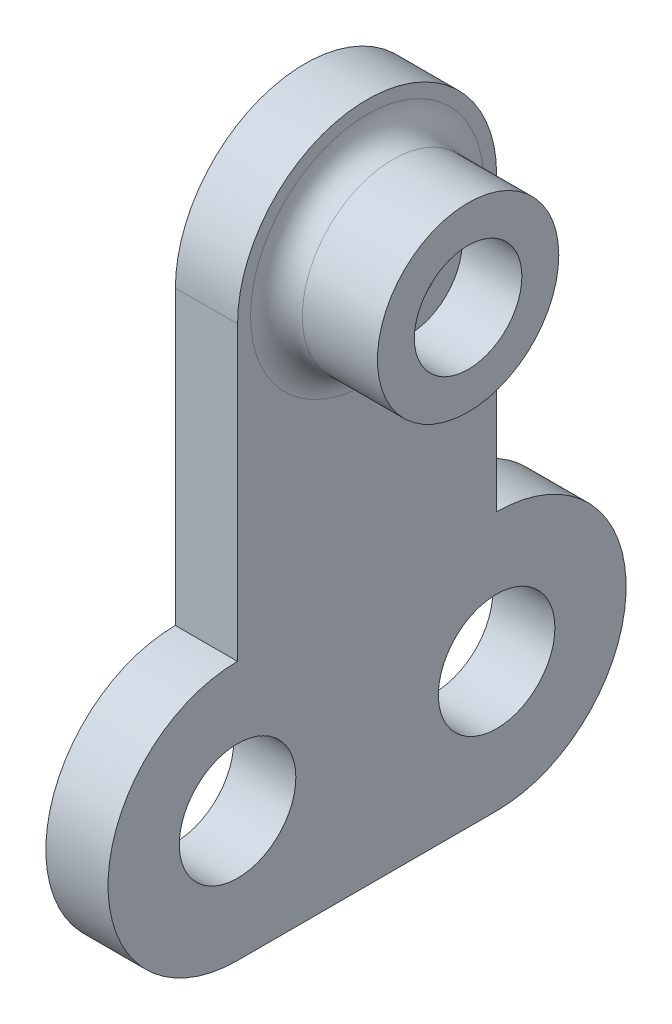
ISO-10303-21;
HEADER;
FILE_DESCRIPTION(('STEP AP214'),'2;1');
FILE_NAME('part.step','',(''),(''),'','','');
FILE_SCHEMA(('AUTOMOTIVE_DESIGN { 1 0 10303 214 1 1 1 1 }'));
ENDSEC;
DATA;
#1=APPLICATION_CONTEXT('core data for automotive mechanical design processes');
#2=APPLICATION_PROTOCOL_DEFINITION('international standard','automotive_design',2000,#1);
#3=PRODUCT_CONTEXT('',#1,'mechanical');
#4=PRODUCT('Part','Part','',(#3));
#5=PRODUCT_RELATED_PRODUCT_CATEGORY('part','',(#4));
#6=PRODUCT_DEFINITION_FORMATION('','',#4);
#7=PRODUCT_DEFINITION_CONTEXT('part definition',#1,'design');
#8=PRODUCT_DEFINITION('design','',#6,#7);
#9=PRODUCT_DEFINITION_SHAPE('','',#8);
#10=(LENGTH_UNIT() NAMED_UNIT(*) SI_UNIT(.MILLI.,.METRE.));
#11=(NAMED_UNIT(*) PLANE_ANGLE_UNIT() SI_UNIT($,.RADIAN.));
#12=(NAMED_UNIT(*) SI_UNIT($,.STERADIAN.) SOLID_ANGLE_UNIT());
#13=UNCERTAINTY_MEASURE_WITH_UNIT(LENGTH_MEASURE(1.E-05),#10,'distance_accuracy_value','');
#14=(GEOMETRIC_REPRESENTATION_CONTEXT(3) GLOBAL_UNCERTAINTY_ASSIGNED_CONTEXT((#13)) GLOBAL_UNIT_ASSIGNED_CONTEXT((#10,
#11,#12)) REPRESENTATION_CONTEXT('',''));
#15=CARTESIAN_POINT('',(0.,0.,0.));
#16=DIRECTION('',(0.,0.,1.));
#17=DIRECTION('',(1.,0.,0.));
#18=AXIS2_PLACEMENT_3D('',#15,#16,#17);
#19=CARTESIAN_POINT('',(2.4,21.2821563056051,0.));
#20=DIRECTION('',(-1.,0.,0.));
#21=DIRECTION('',(0.,0.,1.));
#22=AXIS2_PLACEMENT_3D('',#19,#20,#21);
#23=CYLINDRICAL_SURFACE('',#22,2.075);
#24=CARTESIAN_POINT('',(6.3,21.2821563056051,0.));
#25=DIRECTION('',(1.,0.,0.));
#26=DIRECTION('',(0.,0.,-1.));
#27=AXIS2_PLACEMENT_3D('',#24,#25,#26);
#28=CIRCLE('',#27,2.075);
#29=CARTESIAN_POINT('',(6.3,21.2821563056051,-2.075));
#30=VERTEX_POINT('',#29);
#31=EDGE_CURVE('E224',#30,#30,#28,.T.);
#32=ORIENTED_EDGE('',*,*,#31,.T.);
#33=EDGE_LOOP('',(#32));
#34=FACE_BOUND('',#33,.T.);
#35=CARTESIAN_POINT('',(4.,21.2821563056051,0.));
#36=DIRECTION('',(-1.,0.,0.));
#37=DIRECTION('',(0.,0.,1.));
#38=AXIS2_PLACEMENT_3D('',#35,#36,#37);
#39=CIRCLE('',#38,2.075);
#40=CARTESIAN_POINT('',(4.,21.2821563056051,2.075));
#41=VERTEX_POINT('',#40);
#42=EDGE_CURVE('E228',#41,#41,#39,.T.);
#43=ORIENTED_EDGE('',*,*,#42,.T.);
#44=EDGE_LOOP('',(#43));
#45=FACE_BOUND('',#44,.T.);
#46=ADVANCED_FACE('F41',(#34,#45),#23,.F.);
#47=CARTESIAN_POINT('',(2.4,5.,5.));
#48=DIRECTION('',(1.,0.,0.));
#49=DIRECTION('',(0.,0.,-1.));
#50=AXIS2_PLACEMENT_3D('',#47,#48,#49);
#51=PLANE('',#50);
#52=CARTESIAN_POINT('',(2.4,21.2821563056051,0.));
#53=DIRECTION('',(1.,0.,0.));
#54=DIRECTION('',(0.,0.,-1.));
#55=AXIS2_PLACEMENT_3D('',#52,#53,#54);
#56=CIRCLE('',#55,4.5);
#57=CARTESIAN_POINT('',(2.4,21.2821563056051,-4.5));
#58=VERTEX_POINT('',#57);
#59=EDGE_CURVE('E11',#58,#58,#56,.F.);
#60=ORIENTED_EDGE('',*,*,#59,.T.);
#61=EDGE_LOOP('',(#60));
#62=FACE_BOUND('',#61,.T.);
#63=CARTESIAN_POINT('',(2.4,5.,-5.));
#64=DIRECTION('',(1.,0.,0.));
#65=DIRECTION('',(0.,0.,-1.));
#66=AXIS2_PLACEMENT_3D('',#63,#64,#65);
#67=CIRCLE('',#66,2.25);
#68=CARTESIAN_POINT('',(2.4,5.,-7.25));
#69=VERTEX_POINT('',#68);
#70=EDGE_CURVE('E212',#69,#69,#67,.T.);
#71=ORIENTED_EDGE('',*,*,#70,.F.);
#72=EDGE_LOOP('',(#71));
#73=FACE_BOUND('',#72,.T.);
#74=CARTESIAN_POINT('',(2.4,5.,5.));
#75=DIRECTION('',(1.,0.,0.));
#76=DIRECTION('',(0.,0.,-1.));
#77=AXIS2_PLACEMENT_3D('',#74,#75,#76);
#78=CIRCLE('',#77,5.);
#79=CARTESIAN_POINT('',(2.4,10.,5.));
#80=VERTEX_POINT('',#79);
#81=CARTESIAN_POINT('',(2.4,0.,5.));
#82=VERTEX_POINT('',#81);
#83=EDGE_CURVE('E139',#80,#82,#78,.T.);
#84=ORIENTED_EDGE('',*,*,#83,.T.);
#85=DIRECTION('',(0.,0.,-1.));
#86=VECTOR('',#85,1.);
#87=CARTESIAN_POINT('',(2.4,0.,5.));
#88=LINE('',#87,#86);
#89=CARTESIAN_POINT('',(2.4,0.,-5.));
#90=VERTEX_POINT('',#89);
#91=EDGE_CURVE('E98',#82,#90,#88,.T.);
#92=ORIENTED_EDGE('',*,*,#91,.T.);
#93=CARTESIAN_POINT('',(2.4,5.,-5.));
#94=DIRECTION('',(1.,0.,0.));
#95=DIRECTION('',(0.,0.,-1.));
#96=AXIS2_PLACEMENT_3D('',#93,#94,#95);
#97=CIRCLE('',#96,5.);
#98=CARTESIAN_POINT('',(2.4,10.,-5.));
#99=VERTEX_POINT('',#98);
#100=EDGE_CURVE('E109',#90,#99,#97,.T.);
#101=ORIENTED_EDGE('',*,*,#100,.T.);
#102=DIRECTION('',(0.,1.,0.));
#103=VECTOR('',#102,1.);
#104=CARTESIAN_POINT('',(2.4,10.,-5.));
#105=LINE('',#104,#103);
#106=CARTESIAN_POINT('',(2.4,21.2821563056051,-5.));
#107=VERTEX_POINT('',#106);
#108=EDGE_CURVE('E101',#99,#107,#105,.T.);
#109=ORIENTED_EDGE('',*,*,#108,.T.);
#110=CARTESIAN_POINT('',(2.4,21.2821563056051,0.));
#111=DIRECTION('',(1.,0.,0.));
#112=DIRECTION('',(0.,0.,1.));
#113=AXIS2_PLACEMENT_3D('',#110,#111,#112);
#114=CIRCLE('',#113,5.);
#115=CARTESIAN_POINT('',(2.4,21.2821563056051,5.));
#116=VERTEX_POINT('',#115);
#117=EDGE_CURVE('E108',#107,#116,#114,.T.);
#118=ORIENTED_EDGE('',*,*,#117,.T.);
#119=DIRECTION('',(0.,-1.,0.));
#120=VECTOR('',#119,1.);
#121=CARTESIAN_POINT('',(2.4,10.,5.));
#122=LINE('',#121,#120);
#123=EDGE_CURVE('E59',#116,#80,#122,.T.);
#124=ORIENTED_EDGE('',*,*,#123,.T.);
#125=EDGE_LOOP('',(#84,#92,#101,#109,#118,#124));
#126=FACE_BOUND('',#125,.T.);
#127=CARTESIAN_POINT('',(2.4,5.,5.));
#128=DIRECTION('',(1.,0.,0.));
#129=DIRECTION('',(0.,0.,-1.));
#130=AXIS2_PLACEMENT_3D('',#127,#128,#129);
#131=CIRCLE('',#130,2.25);
#132=CARTESIAN_POINT('',(2.4,5.,2.75));
#133=VERTEX_POINT('',#132);
#134=EDGE_CURVE('E134',#133,#133,#131,.T.);
#135=ORIENTED_EDGE('',*,*,#134,.F.);
#136=EDGE_LOOP('',(#135));
#137=FACE_BOUND('',#136,.T.);
#138=ADVANCED_FACE('F102',(#62,#73,#126,#137),#51,.T.);
#139=CARTESIAN_POINT('',(0.,5.,5.));
#140=DIRECTION('',(1.,0.,0.));
#141=DIRECTION('',(0.,0.,-1.));
#142=AXIS2_PLACEMENT_3D('',#139,#140,#141);
#143=PLANE('',#142);
#144=CARTESIAN_POINT('',(0.,5.,5.));
#145=DIRECTION('',(1.,0.,0.));
#146=DIRECTION('',(0.,0.,-1.));
#147=AXIS2_PLACEMENT_3D('',#144,#145,#146);
#148=CIRCLE('',#147,5.);
#149=CARTESIAN_POINT('',(0.,10.,5.));
#150=VERTEX_POINT('',#149);
#151=CARTESIAN_POINT('',(0.,0.,5.));
#152=VERTEX_POINT('',#151);
#153=EDGE_CURVE('E127',#150,#152,#148,.T.);
#154=ORIENTED_EDGE('',*,*,#153,.F.);
#155=DIRECTION('',(0.,-1.,0.));
#156=VECTOR('',#155,1.);
#157=CARTESIAN_POINT('',(0.,10.,5.));
#158=LINE('',#157,#156);
#159=CARTESIAN_POINT('',(0.,21.2821563056051,5.));
#160=VERTEX_POINT('',#159);
#161=EDGE_CURVE('E89',#160,#150,#158,.T.);
#162=ORIENTED_EDGE('',*,*,#161,.F.);
#163=CARTESIAN_POINT('',(0.,21.2821563056051,0.));
#164=DIRECTION('',(1.,0.,0.));
#165=DIRECTION('',(0.,0.,1.));
#166=AXIS2_PLACEMENT_3D('',#163,#164,#165);
#167=CIRCLE('',#166,5.);
#168=CARTESIAN_POINT('',(0.,21.2821563056051,-5.));
#169=VERTEX_POINT('',#168);
#170=EDGE_CURVE('E83',#169,#160,#167,.T.);
#171=ORIENTED_EDGE('',*,*,#170,.F.);
#172=DIRECTION('',(0.,1.,0.));
#173=VECTOR('',#172,1.);
#174=CARTESIAN_POINT('',(0.,10.,-5.));
#175=LINE('',#174,#173);
#176=CARTESIAN_POINT('',(0.,10.,-5.));
#177=VERTEX_POINT('',#176);
#178=EDGE_CURVE('E117',#177,#169,#175,.T.);
#179=ORIENTED_EDGE('',*,*,#178,.F.);
#180=CARTESIAN_POINT('',(0.,5.,-5.));
#181=DIRECTION('',(1.,0.,0.));
#182=DIRECTION('',(0.,0.,-1.));
#183=AXIS2_PLACEMENT_3D('',#180,#181,#182);
#184=CIRCLE('',#183,5.);
#185=CARTESIAN_POINT('',(0.,0.,-5.));
#186=VERTEX_POINT('',#185);
#187=EDGE_CURVE('E135',#186,#177,#184,.T.);
#188=ORIENTED_EDGE('',*,*,#187,.F.);
#189=DIRECTION('',(0.,0.,-1.));
#190=VECTOR('',#189,1.);
#191=CARTESIAN_POINT('',(0.,0.,5.));
#192=LINE('',#191,#190);
#193=EDGE_CURVE('E133',#152,#186,#192,.T.);
#194=ORIENTED_EDGE('',*,*,#193,.F.);
#195=EDGE_LOOP('',(#154,#162,#171,#179,#188,#194));
#196=FACE_BOUND('',#195,.T.);
#197=CARTESIAN_POINT('',(0.,5.,5.));
#198=DIRECTION('',(1.,0.,0.));
#199=DIRECTION('',(0.,0.,-1.));
#200=AXIS2_PLACEMENT_3D('',#197,#198,#199);
#201=CIRCLE('',#200,2.25);
#202=CARTESIAN_POINT('',(0.,5.,2.75));
#203=VERTEX_POINT('',#202);
#204=EDGE_CURVE('E208',#203,#203,#201,.T.);
#205=ORIENTED_EDGE('',*,*,#204,.T.);
#206=EDGE_LOOP('',(#205));
#207=FACE_BOUND('',#206,.T.);
#208=CARTESIAN_POINT('',(0.,5.,-5.));
#209=DIRECTION('',(1.,0.,0.));
#210=DIRECTION('',(0.,0.,-1.));
#211=AXIS2_PLACEMENT_3D('',#208,#209,#210);
#212=CIRCLE('',#211,2.25);
#213=CARTESIAN_POINT('',(0.,5.,-7.25));
#214=VERTEX_POINT('',#213);
#215=EDGE_CURVE('E218',#214,#214,#212,.T.);
#216=ORIENTED_EDGE('',*,*,#215,.T.);
#217=EDGE_LOOP('',(#216));
#218=FACE_BOUND('',#217,.T.);
#219=CARTESIAN_POINT('',(0.,21.2821563056051,0.));
#220=DIRECTION('',(-1.,0.,0.));
#221=DIRECTION('',(0.,0.,1.));
#222=AXIS2_PLACEMENT_3D('',#219,#220,#221);
#223=CIRCLE('',#222,1.2);
#224=CARTESIAN_POINT('',(0.,21.2821563056051,1.2));
#225=VERTEX_POINT('',#224);
#226=EDGE_CURVE('E229',#225,#225,#223,.T.);
#227=ORIENTED_EDGE('',*,*,#226,.F.);
#228=EDGE_LOOP('',(#227));
#229=FACE_BOUND('',#228,.T.);
#230=ADVANCED_FACE('F173',(#196,#207,#218,#229),#143,.F.);
#231=CARTESIAN_POINT('',(2.4,5.,5.));
#232=DIRECTION('',(-1.,0.,0.));
#233=DIRECTION('',(0.,0.,1.));
#234=AXIS2_PLACEMENT_3D('',#231,#232,#233);
#235=CYLINDRICAL_SURFACE('',#234,5.);
#236=ORIENTED_EDGE('',*,*,#153,.T.);
#237=DIRECTION('',(-1.,0.,0.));
#238=VECTOR('',#237,1.);
#239=CARTESIAN_POINT('',(2.4,0.,5.));
#240=LINE('',#239,#238);
#241=EDGE_CURVE('E148',#82,#152,#240,.T.);
#242=ORIENTED_EDGE('',*,*,#241,.F.);
#243=ORIENTED_EDGE('',*,*,#83,.F.);
#244=DIRECTION('',(-1.,0.,0.));
#245=VECTOR('',#244,1.);
#246=CARTESIAN_POINT('',(2.4,10.,5.));
#247=LINE('',#246,#245);
#248=EDGE_CURVE('E121',#80,#150,#247,.T.);
#249=ORIENTED_EDGE('',*,*,#248,.T.);
#250=EDGE_LOOP('',(#236,#242,#243,#249));
#251=FACE_BOUND('',#250,.T.);
#252=ADVANCED_FACE('F182',(#251),#235,.T.);
#253=CARTESIAN_POINT('',(2.4,0.,5.));
#254=DIRECTION('',(0.,1.,0.));
#255=DIRECTION('',(0.,0.,1.));
#256=AXIS2_PLACEMENT_3D('',#253,#254,#255);
#257=PLANE('',#256);
#258=ORIENTED_EDGE('',*,*,#193,.T.);
#259=DIRECTION('',(-1.,0.,0.));
#260=VECTOR('',#259,1.);
#261=CARTESIAN_POINT('',(2.4,0.,-5.));
#262=LINE('',#261,#260);
#263=EDGE_CURVE('E141',#90,#186,#262,.T.);
#264=ORIENTED_EDGE('',*,*,#263,.F.);
#265=ORIENTED_EDGE('',*,*,#91,.F.);
#266=ORIENTED_EDGE('',*,*,#241,.T.);
#267=EDGE_LOOP('',(#258,#264,#265,#266));
#268=FACE_BOUND('',#267,.T.);
#269=ADVANCED_FACE('F191',(#268),#257,.F.);
#270=CARTESIAN_POINT('',(2.4,5.,-5.));
#271=DIRECTION('',(-1.,0.,0.));
#272=DIRECTION('',(0.,0.,1.));
#273=AXIS2_PLACEMENT_3D('',#270,#271,#272);
#274=CYLINDRICAL_SURFACE('',#273,5.);
#275=ORIENTED_EDGE('',*,*,#187,.T.);
#276=DIRECTION('',(-1.,0.,0.));
#277=VECTOR('',#276,1.);
#278=CARTESIAN_POINT('',(2.4,10.,-5.));
#279=LINE('',#278,#277);
#280=EDGE_CURVE('E118',#99,#177,#279,.T.);
#281=ORIENTED_EDGE('',*,*,#280,.F.);
#282=ORIENTED_EDGE('',*,*,#100,.F.);
#283=ORIENTED_EDGE('',*,*,#263,.T.);
#284=EDGE_LOOP('',(#275,#281,#282,#283));
#285=FACE_BOUND('',#284,.T.);
#286=ADVANCED_FACE('F194',(#285),#274,.T.);
#287=CARTESIAN_POINT('',(2.4,10.,-5.));
#288=DIRECTION('',(0.,0.,1.));
#289=DIRECTION('',(0.,-1.,0.));
#290=AXIS2_PLACEMENT_3D('',#287,#288,#289);
#291=PLANE('',#290);
#292=ORIENTED_EDGE('',*,*,#178,.T.);
#293=DIRECTION('',(-1.,0.,0.));
#294=VECTOR('',#293,1.);
#295=CARTESIAN_POINT('',(2.4,21.2821563056051,-5.));
#296=LINE('',#295,#294);
#297=EDGE_CURVE('E114',#107,#169,#296,.T.);
#298=ORIENTED_EDGE('',*,*,#297,.F.);
#299=ORIENTED_EDGE('',*,*,#108,.F.);
#300=ORIENTED_EDGE('',*,*,#280,.T.);
#301=EDGE_LOOP('',(#292,#298,#299,#300));
#302=FACE_BOUND('',#301,.T.);
#303=ADVANCED_FACE('F116',(#302),#291,.F.);
#304=CARTESIAN_POINT('',(2.4,21.2821563056051,0.));
#305=DIRECTION('',(-1.,0.,0.));
#306=DIRECTION('',(0.,0.,1.));
#307=AXIS2_PLACEMENT_3D('',#304,#305,#306);
#308=CYLINDRICAL_SURFACE('',#307,5.);
#309=ORIENTED_EDGE('',*,*,#170,.T.);
#310=DIRECTION('',(-1.,0.,0.));
#311=VECTOR('',#310,1.);
#312=CARTESIAN_POINT('',(2.4,21.2821563056051,5.));
#313=LINE('',#312,#311);
#314=EDGE_CURVE('E119',#116,#160,#313,.T.);
#315=ORIENTED_EDGE('',*,*,#314,.F.);
#316=ORIENTED_EDGE('',*,*,#117,.F.);
#317=ORIENTED_EDGE('',*,*,#297,.T.);
#318=EDGE_LOOP('',(#309,#315,#316,#317));
#319=FACE_BOUND('',#318,.T.);
#320=ADVANCED_FACE('F125',(#319),#308,.T.);
#321=CARTESIAN_POINT('',(2.4,10.,5.));
#322=DIRECTION('',(0.,0.,-1.));
#323=DIRECTION('',(0.,1.,0.));
#324=AXIS2_PLACEMENT_3D('',#321,#322,#323);
#325=PLANE('',#324);
#326=ORIENTED_EDGE('',*,*,#161,.T.);
#327=ORIENTED_EDGE('',*,*,#248,.F.);
#328=ORIENTED_EDGE('',*,*,#123,.F.);
#329=ORIENTED_EDGE('',*,*,#314,.T.);
#330=EDGE_LOOP('',(#326,#327,#328,#329));
#331=FACE_BOUND('',#330,.T.);
#332=ADVANCED_FACE('F184',(#331),#325,.F.);
#333=CARTESIAN_POINT('',(2.4,5.,5.));
#334=DIRECTION('',(-1.,0.,0.));
#335=DIRECTION('',(0.,0.,1.));
#336=AXIS2_PLACEMENT_3D('',#333,#334,#335);
#337=CYLINDRICAL_SURFACE('',#336,2.25);
#338=ORIENTED_EDGE('',*,*,#134,.T.);
#339=EDGE_LOOP('',(#338));
#340=FACE_BOUND('',#339,.T.);
#341=ORIENTED_EDGE('',*,*,#204,.F.);
#342=EDGE_LOOP('',(#341));
#343=FACE_BOUND('',#342,.T.);
#344=ADVANCED_FACE('F177',(#340,#343),#337,.F.);
#345=CARTESIAN_POINT('',(2.4,5.,-5.));
#346=DIRECTION('',(-1.,0.,0.));
#347=DIRECTION('',(0.,0.,1.));
#348=AXIS2_PLACEMENT_3D('',#345,#346,#347);
#349=CYLINDRICAL_SURFACE('',#348,2.25);
#350=ORIENTED_EDGE('',*,*,#70,.T.);
#351=EDGE_LOOP('',(#350));
#352=FACE_BOUND('',#351,.T.);
#353=ORIENTED_EDGE('',*,*,#215,.F.);
#354=EDGE_LOOP('',(#353));
#355=FACE_BOUND('',#354,.T.);
#356=ADVANCED_FACE('F246',(#352,#355),#349,.F.);
#357=CARTESIAN_POINT('',(6.3,21.2821563056051,0.));
#358=DIRECTION('',(1.,0.,0.));
#359=DIRECTION('',(0.,0.,-1.));
#360=AXIS2_PLACEMENT_3D('',#357,#358,#359);
#361=PLANE('',#360);
#362=CARTESIAN_POINT('',(6.3,21.2821563056051,0.));
#363=DIRECTION('',(1.,0.,0.));
#364=DIRECTION('',(0.,0.,-1.));
#365=AXIS2_PLACEMENT_3D('',#362,#363,#364);
#366=CIRCLE('',#365,3.5);
#367=CARTESIAN_POINT('',(6.3,21.2821563056051,-3.5));
#368=VERTEX_POINT('',#367);
#369=EDGE_CURVE('E220',#368,#368,#366,.T.);
#370=ORIENTED_EDGE('',*,*,#369,.T.);
#371=EDGE_LOOP('',(#370));
#372=FACE_BOUND('',#371,.T.);
#373=ORIENTED_EDGE('',*,*,#31,.F.);
#374=EDGE_LOOP('',(#373));
#375=FACE_BOUND('',#374,.T.);
#376=ADVANCED_FACE('F165',(#372,#375),#361,.T.);
#377=CARTESIAN_POINT('',(6.3,21.2821563056051,0.));
#378=DIRECTION('',(-1.,0.,0.));
#379=DIRECTION('',(0.,0.,1.));
#380=AXIS2_PLACEMENT_3D('',#377,#378,#379);
#381=CYLINDRICAL_SURFACE('',#380,3.5);
#382=CARTESIAN_POINT('',(3.4,21.2821563056051,0.));
#383=DIRECTION('',(1.,0.,0.));
#384=DIRECTION('',(0.,0.,-1.));
#385=AXIS2_PLACEMENT_3D('',#382,#383,#384);
#386=CIRCLE('',#385,3.5);
#387=CARTESIAN_POINT('',(3.4,21.2821563056051,-3.5));
#388=VERTEX_POINT('',#387);
#389=EDGE_CURVE('E49',#388,#388,#386,.T.);
#390=ORIENTED_EDGE('',*,*,#389,.T.);
#391=EDGE_LOOP('',(#390));
#392=FACE_BOUND('',#391,.T.);
#393=ORIENTED_EDGE('',*,*,#369,.F.);
#394=EDGE_LOOP('',(#393));
#395=FACE_BOUND('',#394,.T.);
#396=ADVANCED_FACE('F146',(#392,#395),#381,.T.);
#397=CARTESIAN_POINT('',(3.4,21.2821563056051,0.));
#398=DIRECTION('',(1.,0.,0.));
#399=DIRECTION('',(0.,0.,-1.));
#400=AXIS2_PLACEMENT_3D('',#397,#398,#399);
#401=TOROIDAL_SURFACE('',#400,4.5,1.);
#402=ORIENTED_EDGE('',*,*,#59,.F.);
#403=EDGE_LOOP('',(#402));
#404=FACE_BOUND('',#403,.T.);
#405=ORIENTED_EDGE('',*,*,#389,.F.);
#406=EDGE_LOOP('',(#405));
#407=FACE_BOUND('',#406,.T.);
#408=ADVANCED_FACE('F43',(#404,#407),#401,.F.);
#409=CARTESIAN_POINT('',(4.,21.2821563056051,0.));
#410=DIRECTION('',(-1.,0.,0.));
#411=DIRECTION('',(0.,0.,1.));
#412=AXIS2_PLACEMENT_3D('',#409,#410,#411);
#413=PLANE('',#412);
#414=CARTESIAN_POINT('',(4.,21.2821563056051,0.));
#415=DIRECTION('',(-1.,0.,0.));
#416=DIRECTION('',(0.,0.,1.));
#417=AXIS2_PLACEMENT_3D('',#414,#415,#416);
#418=CIRCLE('',#417,1.2);
#419=CARTESIAN_POINT('',(4.,21.2821563056051,1.2));
#420=VERTEX_POINT('',#419);
#421=EDGE_CURVE('E230',#420,#420,#418,.T.);
#422=ORIENTED_EDGE('',*,*,#421,.T.);
#423=EDGE_LOOP('',(#422));
#424=FACE_BOUND('',#423,.T.);
#425=ORIENTED_EDGE('',*,*,#42,.F.);
#426=EDGE_LOOP('',(#425));
#427=FACE_BOUND('',#426,.T.);
#428=ADVANCED_FACE('F155',(#424,#427),#413,.F.);
#429=CARTESIAN_POINT('',(4.,21.2821563056051,0.));
#430=DIRECTION('',(-1.,0.,0.));
#431=DIRECTION('',(0.,0.,1.));
#432=AXIS2_PLACEMENT_3D('',#429,#430,#431);
#433=CYLINDRICAL_SURFACE('',#432,1.2);
#434=ORIENTED_EDGE('',*,*,#421,.F.);
#435=EDGE_LOOP('',(#434));
#436=FACE_BOUND('',#435,.T.);
#437=ORIENTED_EDGE('',*,*,#226,.T.);
#438=EDGE_LOOP('',(#437));
#439=FACE_BOUND('',#438,.T.);
#440=ADVANCED_FACE('F163',(#436,#439),#433,.F.);
#441=CLOSED_SHELL('',(#46,#138,#230,#252,#269,#286,#303,#320,#332,#344,#356,#376,#396,#408,#428,#440));
#442=MANIFOLD_SOLID_BREP('B2',#441);
#443=ADVANCED_BREP_SHAPE_REPRESENTATION('',(#18,#442),#14);
#444=SHAPE_DEFINITION_REPRESENTATION(#9,#443);
ENDSEC;
END-ISO-10303-21;
